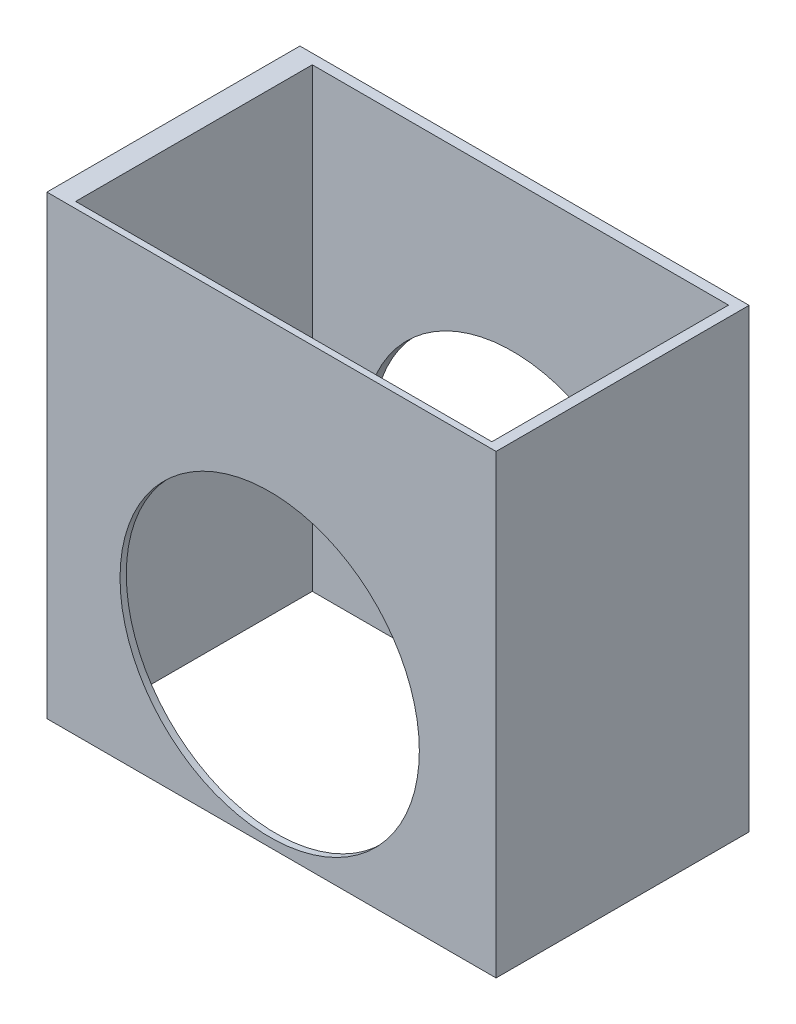
ISO-10303-21;
HEADER;
FILE_DESCRIPTION(('STEP AP214'),'2;1');
FILE_NAME('part.step','',(''),(''),'','','');
FILE_SCHEMA(('AUTOMOTIVE_DESIGN { 1 0 10303 214 1 1 1 1 }'));
ENDSEC;
DATA;
#1=APPLICATION_CONTEXT('core data for automotive mechanical design processes');
#2=APPLICATION_PROTOCOL_DEFINITION('international standard','automotive_design',2000,#1);
#3=PRODUCT_CONTEXT('',#1,'mechanical');
#4=PRODUCT('Part','Part','',(#3));
#5=PRODUCT_RELATED_PRODUCT_CATEGORY('part','',(#4));
#6=PRODUCT_DEFINITION_FORMATION('','',#4);
#7=PRODUCT_DEFINITION_CONTEXT('part definition',#1,'design');
#8=PRODUCT_DEFINITION('design','',#6,#7);
#9=PRODUCT_DEFINITION_SHAPE('','',#8);
#10=(LENGTH_UNIT() NAMED_UNIT(*) SI_UNIT(.MILLI.,.METRE.));
#11=(NAMED_UNIT(*) PLANE_ANGLE_UNIT() SI_UNIT($,.RADIAN.));
#12=(NAMED_UNIT(*) SI_UNIT($,.STERADIAN.) SOLID_ANGLE_UNIT());
#13=UNCERTAINTY_MEASURE_WITH_UNIT(LENGTH_MEASURE(1.E-05),#10,'distance_accuracy_value','');
#14=(GEOMETRIC_REPRESENTATION_CONTEXT(3) GLOBAL_UNCERTAINTY_ASSIGNED_CONTEXT((#13)) GLOBAL_UNIT_ASSIGNED_CONTEXT((#10,
#11,#12)) REPRESENTATION_CONTEXT('',''));
#15=CARTESIAN_POINT('',(0.,0.,0.));
#16=DIRECTION('',(0.,0.,1.));
#17=DIRECTION('',(1.,0.,0.));
#18=AXIS2_PLACEMENT_3D('',#15,#16,#17);
#19=CARTESIAN_POINT('',(-12.0460468644725,8.43050583882376,-22.098));
#20=DIRECTION('',(0.,0.,1.));
#21=DIRECTION('',(1.,0.,0.));
#22=AXIS2_PLACEMENT_3D('',#19,#20,#21);
#23=CYLINDRICAL_SURFACE('',#22,7.96243527646691);
#24=CARTESIAN_POINT('',(-12.0460468644725,8.43050583882376,0.536104612442211));
#25=DIRECTION('',(0.,0.,-1.));
#26=DIRECTION('',(-1.,0.,0.));
#27=AXIS2_PLACEMENT_3D('',#24,#25,#26);
#28=CIRCLE('',#27,7.96243527646691);
#29=CARTESIAN_POINT('',(-4.08361158800558,8.43050583882376,0.536104612442214));
#30=VERTEX_POINT('',#29);
#31=EDGE_CURVE('E142',#30,#30,#28,.F.);
#32=CARTESIAN_POINT('',(-12.0460468644725,8.43050583882376,0.));
#33=DIRECTION('',(0.,0.,1.));
#34=DIRECTION('',(1.,0.,0.));
#35=AXIS2_PLACEMENT_3D('',#32,#33,#34);
#36=CIRCLE('',#35,7.96243527646691);
#37=CARTESIAN_POINT('',(-4.08361158800558,8.43050583882376,0.));
#38=VERTEX_POINT('',#37);
#39=EDGE_CURVE('E151',#38,#38,#36,.T.);
#40=CARTESIAN_POINT('',(-4.08361158800558,8.43050583882376,0.536104612442214));
#41=CARTESIAN_POINT('',(-4.08361158800558,8.43050583882376,0.530520189395941));
#42=CARTESIAN_POINT('',(-4.08361158800558,8.43050583882376,0.524935766349667));
#43=CARTESIAN_POINT('',(-4.08361158800558,8.43050583882376,0.513766920257121));
#44=CARTESIAN_POINT('',(-4.08361158800558,8.43050583882376,0.508182497210847));
#45=CARTESIAN_POINT('',(-4.08361158800558,8.43050583882376,0.497013651118301));
#46=CARTESIAN_POINT('',(-4.08361158800558,8.43050583882376,0.491429228072029));
#47=CARTESIAN_POINT('',(-4.08361158800558,8.43050583882376,0.480260381979484));
#48=CARTESIAN_POINT('',(-4.08361158800558,8.43050583882376,0.47467595893321));
#49=CARTESIAN_POINT('',(-4.08361158800558,8.43050583882376,0.463507112840663));
#50=CARTESIAN_POINT('',(-4.08361158800558,8.43050583882376,0.45792268979439));
#51=CARTESIAN_POINT('',(-4.08361158800558,8.43050583882376,0.446753843701844));
#52=CARTESIAN_POINT('',(-4.08361158800558,8.43050583882376,0.441169420655572));
#53=CARTESIAN_POINT('',(-4.08361158800558,8.43050583882376,0.430000574563027));
#54=CARTESIAN_POINT('',(-4.08361158800558,8.43050583882376,0.424416151516753));
#55=CARTESIAN_POINT('',(-4.08361158800558,8.43050583882376,0.413247305424206));
#56=CARTESIAN_POINT('',(-4.08361158800558,8.43050583882376,0.407662882377933));
#57=CARTESIAN_POINT('',(-4.08361158800558,8.43050583882376,0.396494036285386));
#58=CARTESIAN_POINT('',(-4.08361158800558,8.43050583882376,0.390909613239113));
#59=CARTESIAN_POINT('',(-4.08361158800558,8.43050583882376,0.379740767146566));
#60=CARTESIAN_POINT('',(-4.08361158800558,8.43050583882376,0.374156344100293));
#61=CARTESIAN_POINT('',(-4.08361158800558,8.43050583882376,0.362987498007747));
#62=CARTESIAN_POINT('',(-4.08361158800558,8.43050583882376,0.357403074961475));
#63=CARTESIAN_POINT('',(-4.08361158800558,8.43050583882376,0.346234228868929));
#64=CARTESIAN_POINT('',(-4.08361158800558,8.43050583882376,0.340649805822656));
#65=CARTESIAN_POINT('',(-4.08361158800558,8.43050583882376,0.329480959730109));
#66=CARTESIAN_POINT('',(-4.08361158800558,8.43050583882376,0.323896536683836));
#67=CARTESIAN_POINT('',(-4.08361158800558,8.43050583882376,0.31272769059129));
#68=CARTESIAN_POINT('',(-4.08361158800558,8.43050583882376,0.307143267545018));
#69=CARTESIAN_POINT('',(-4.08361158800558,8.43050583882376,0.295974421452472));
#70=CARTESIAN_POINT('',(-4.08361158800558,8.43050583882376,0.290389998406199));
#71=CARTESIAN_POINT('',(-4.08361158800558,8.43050583882376,0.279221152313652));
#72=CARTESIAN_POINT('',(-4.08361158800558,8.43050583882376,0.273636729267379));
#73=CARTESIAN_POINT('',(-4.08361158800558,8.43050583882376,0.262467883174832));
#74=CARTESIAN_POINT('',(-4.08361158800558,8.43050583882376,0.256883460128559));
#75=CARTESIAN_POINT('',(-4.08361158800558,8.43050583882376,0.245714614036012));
#76=CARTESIAN_POINT('',(-4.08361158800558,8.43050583882376,0.240130190989738));
#77=CARTESIAN_POINT('',(-4.08361158800558,8.43050583882376,0.228961344897193));
#78=CARTESIAN_POINT('',(-4.08361158800558,8.43050583882376,0.223376921850921));
#79=CARTESIAN_POINT('',(-4.08361158800558,8.43050583882376,0.212208075758375));
#80=CARTESIAN_POINT('',(-4.08361158800558,8.43050583882376,0.206623652712101));
#81=CARTESIAN_POINT('',(-4.08361158800558,8.43050583882376,0.195454806619555));
#82=CARTESIAN_POINT('',(-4.08361158800558,8.43050583882376,0.189870383573281));
#83=CARTESIAN_POINT('',(-4.08361158800558,8.43050583882376,0.178701537480736));
#84=CARTESIAN_POINT('',(-4.08361158800558,8.43050583882376,0.173117114434463));
#85=CARTESIAN_POINT('',(-4.08361158800558,8.43050583882376,0.161948268341918));
#86=CARTESIAN_POINT('',(-4.08361158800558,8.43050583882376,0.156363845295644));
#87=CARTESIAN_POINT('',(-4.08361158800558,8.43050583882376,0.145194999203098));
#88=CARTESIAN_POINT('',(-4.08361158800558,8.43050583882376,0.139610576156824));
#89=CARTESIAN_POINT('',(-4.08361158800558,8.43050583882376,0.128441730064278));
#90=CARTESIAN_POINT('',(-4.08361158800558,8.43050583882376,0.122857307018004));
#91=CARTESIAN_POINT('',(-4.08361158800558,8.43050583882376,0.111688460925457));
#92=CARTESIAN_POINT('',(-4.08361158800558,8.43050583882376,0.106104037879184));
#93=CARTESIAN_POINT('',(-4.08361158800558,8.43050583882376,0.0949351917866384));
#94=CARTESIAN_POINT('',(-4.08361158800558,8.43050583882376,0.0893507687403661));
#95=CARTESIAN_POINT('',(-4.08361158800558,8.43050583882376,0.0781819226478205));
#96=CARTESIAN_POINT('',(-4.08361158800558,8.43050583882376,0.0725974996015471));
#97=CARTESIAN_POINT('',(-4.08361158800558,8.43050583882376,0.0614286535090003));
#98=CARTESIAN_POINT('',(-4.08361158800558,8.43050583882376,0.0558442304627269));
#99=CARTESIAN_POINT('',(-4.08361158800558,8.43050583882376,0.0446753843701813));
#100=CARTESIAN_POINT('',(-4.08361158800558,8.43050583882376,0.0390909613239091));
#101=CARTESIAN_POINT('',(-4.08361158800558,8.43050583882376,0.0279221152313635));
#102=CARTESIAN_POINT('',(-4.08361158800558,8.43050583882376,0.0223376921850901));
#103=CARTESIAN_POINT('',(-4.08361158800558,8.43050583882376,0.0111688460925433));
#104=CARTESIAN_POINT('',(-4.08361158800558,8.43050583882376,0.00558442304626992));
#105=CARTESIAN_POINT('',(-4.08361158800558,8.43050583882376,0.));
#106=B_SPLINE_CURVE_WITH_KNOTS('',3,(#40,#41,#42,#43,#44,#45,#46,#47,#48,#49,#50,#51,#52,#53,
#54,#55,#56,#57,#58,#59,#60,#61,#62,#63,#64,#65,#66,#67,#68,#69,#70,#71,#72,#73,#74,#75,#76,#77,
#78,#79,#80,#81,#82,#83,#84,#85,#86,#87,#88,#89,#90,#91,#92,#93,#94,#95,#96,#97,#98,#99,#100,
#101,#102,#103,#104,#105),.UNSPECIFIED.,.F.,.F.,(4,2,2,2,2,2,2,2,2,2,2,2,2,2,2,2,2,2,2,2,2,2,2,
2,2,2,2,2,2,2,2,2,4),(0.,0.0167532691388202,0.0335065382776403,0.050259807416457,
0.0670130765552772,0.0837663456940974,0.100519614832914,0.117272883971734,0.134026153110554,
0.150779422249375,0.167532691388195,0.184285960527011,0.201039229665832,0.217792498804652,
0.234545767943468,0.251299037082289,0.268052306221109,0.284805575359929,0.301558844498749,
0.318312113637566,0.335065382776386,0.351818651915206,0.368571921054023,0.385325190192843,
0.402078459331663,0.418831728470483,0.435584997609303,0.45233826674812,0.46909153588694,
0.48584480502576,0.502598074164577,0.519351343303397,0.536104612442218),.UNSPECIFIED.);
#107=EDGE_CURVE('BSEAM38',#30,#38,#106,.T.);
#108=ORIENTED_EDGE('',*,*,#31,.T.);
#109=ORIENTED_EDGE('',*,*,#39,.F.);
#110=ORIENTED_EDGE('',*,*,#107,.T.);
#111=ORIENTED_EDGE('',*,*,#107,.F.);
#112=EDGE_LOOP('',(#108,#110,#109,#111));
#113=FACE_BOUND('',#112,.T.);
#114=ADVANCED_FACE('F38',(#113),#23,.F.);
#115=CARTESIAN_POINT('',(0.,0.,13.462));
#116=DIRECTION('',(-1.,0.,0.));
#117=DIRECTION('',(0.,0.,1.));
#118=AXIS2_PLACEMENT_3D('',#115,#116,#117);
#119=PLANE('',#118);
#120=DIRECTION('',(0.,1.,0.));
#121=VECTOR('',#120,1.);
#122=CARTESIAN_POINT('',(0.,0.,0.));
#123=LINE('',#122,#121);
#124=CARTESIAN_POINT('',(0.,0.,0.));
#125=VERTEX_POINT('',#124);
#126=CARTESIAN_POINT('',(0.,24.2638461745729,0.));
#127=VERTEX_POINT('',#126);
#128=EDGE_CURVE('E167',#125,#127,#123,.T.);
#129=ORIENTED_EDGE('',*,*,#128,.T.);
#130=DIRECTION('',(0.,0.,-1.));
#131=VECTOR('',#130,1.);
#132=CARTESIAN_POINT('',(0.,24.2638461745729,13.462));
#133=LINE('',#132,#131);
#134=CARTESIAN_POINT('',(0.,24.2638461745729,13.462));
#135=VERTEX_POINT('',#134);
#136=EDGE_CURVE('E190',#135,#127,#133,.T.);
#137=ORIENTED_EDGE('',*,*,#136,.F.);
#138=DIRECTION('',(0.,1.,0.));
#139=VECTOR('',#138,1.);
#140=CARTESIAN_POINT('',(0.,0.,13.462));
#141=LINE('',#140,#139);
#142=CARTESIAN_POINT('',(0.,0.,13.462));
#143=VERTEX_POINT('',#142);
#144=EDGE_CURVE('E152',#143,#135,#141,.T.);
#145=ORIENTED_EDGE('',*,*,#144,.F.);
#146=DIRECTION('',(0.,0.,-1.));
#147=VECTOR('',#146,1.);
#148=CARTESIAN_POINT('',(0.,0.,13.462));
#149=LINE('',#148,#147);
#150=EDGE_CURVE('E166',#143,#125,#149,.T.);
#151=ORIENTED_EDGE('',*,*,#150,.T.);
#152=EDGE_LOOP('',(#129,#137,#145,#151));
#153=FACE_BOUND('',#152,.T.);
#154=ADVANCED_FACE('F40',(#153),#119,.F.);
#155=CARTESIAN_POINT('',(0.,24.2638461745729,13.462));
#156=DIRECTION('',(0.,-1.,0.));
#157=DIRECTION('',(0.,0.,-1.));
#158=AXIS2_PLACEMENT_3D('',#155,#156,#157);
#159=PLANE('',#158);
#160=DIRECTION('',(1.,0.,0.));
#161=VECTOR('',#160,1.);
#162=CARTESIAN_POINT('',(-22.7037503225376,24.2638461745729,13.1276553067743));
#163=LINE('',#162,#161);
#164=CARTESIAN_POINT('',(-22.7037503225376,24.2638461745729,13.1276553067743));
#165=VERTEX_POINT('',#164);
#166=CARTESIAN_POINT('',(-0.558299295930112,24.2638461745729,13.1276553067743));
#167=VERTEX_POINT('',#166);
#168=EDGE_CURVE('E116',#165,#167,#163,.T.);
#169=ORIENTED_EDGE('',*,*,#168,.F.);
#170=DIRECTION('',(0.,0.,1.));
#171=VECTOR('',#170,1.);
#172=CARTESIAN_POINT('',(-22.7037503225376,24.2638461745729,0.536104612442211));
#173=LINE('',#172,#171);
#174=CARTESIAN_POINT('',(-22.7037503225376,24.2638461745729,0.536104612442211));
#175=VERTEX_POINT('',#174);
#176=EDGE_CURVE('E54',#175,#165,#173,.T.);
#177=ORIENTED_EDGE('',*,*,#176,.F.);
#178=DIRECTION('',(-1.,0.,0.));
#179=VECTOR('',#178,1.);
#180=CARTESIAN_POINT('',(-22.7037503225376,24.2638461745729,0.536104612442211));
#181=LINE('',#180,#179);
#182=CARTESIAN_POINT('',(-0.558299295930112,24.2638461745729,0.536104612442211));
#183=VERTEX_POINT('',#182);
#184=EDGE_CURVE('E124',#183,#175,#181,.T.);
#185=ORIENTED_EDGE('',*,*,#184,.F.);
#186=DIRECTION('',(0.,0.,-1.));
#187=VECTOR('',#186,1.);
#188=CARTESIAN_POINT('',(-0.558299295930112,24.2638461745729,0.536104612442211));
#189=LINE('',#188,#187);
#190=EDGE_CURVE('E107',#167,#183,#189,.T.);
#191=ORIENTED_EDGE('',*,*,#190,.F.);
#192=EDGE_LOOP('',(#169,#177,#185,#191));
#193=FACE_BOUND('',#192,.T.);
#194=DIRECTION('',(-1.,0.,0.));
#195=VECTOR('',#194,1.);
#196=CARTESIAN_POINT('',(0.,24.2638461745729,0.));
#197=LINE('',#196,#195);
#198=CARTESIAN_POINT('',(-23.8989763072861,24.2638461745729,0.));
#199=VERTEX_POINT('',#198);
#200=EDGE_CURVE('E171',#127,#199,#197,.T.);
#201=ORIENTED_EDGE('',*,*,#200,.T.);
#202=DIRECTION('',(0.,0.,-1.));
#203=VECTOR('',#202,1.);
#204=CARTESIAN_POINT('',(-23.8989763072861,24.2638461745729,13.462));
#205=LINE('',#204,#203);
#206=CARTESIAN_POINT('',(-23.8989763072861,24.2638461745729,13.462));
#207=VERTEX_POINT('',#206);
#208=EDGE_CURVE('E186',#207,#199,#205,.T.);
#209=ORIENTED_EDGE('',*,*,#208,.F.);
#210=DIRECTION('',(-1.,0.,0.));
#211=VECTOR('',#210,1.);
#212=CARTESIAN_POINT('',(0.,24.2638461745729,13.462));
#213=LINE('',#212,#211);
#214=EDGE_CURVE('E156',#135,#207,#213,.T.);
#215=ORIENTED_EDGE('',*,*,#214,.F.);
#216=ORIENTED_EDGE('',*,*,#136,.T.);
#217=EDGE_LOOP('',(#201,#209,#215,#216));
#218=FACE_BOUND('',#217,.T.);
#219=ADVANCED_FACE('F121',(#193,#218),#159,.F.);
#220=CARTESIAN_POINT('',(-23.8989763072861,0.,13.462));
#221=DIRECTION('',(1.,0.,0.));
#222=DIRECTION('',(0.,0.,-1.));
#223=AXIS2_PLACEMENT_3D('',#220,#221,#222);
#224=PLANE('',#223);
#225=DIRECTION('',(0.,-1.,0.));
#226=VECTOR('',#225,1.);
#227=CARTESIAN_POINT('',(-23.8989763072861,0.,0.));
#228=LINE('',#227,#226);
#229=CARTESIAN_POINT('',(-23.8989763072861,0.,0.));
#230=VERTEX_POINT('',#229);
#231=EDGE_CURVE('E174',#199,#230,#228,.T.);
#232=ORIENTED_EDGE('',*,*,#231,.T.);
#233=DIRECTION('',(0.,0.,-1.));
#234=VECTOR('',#233,1.);
#235=CARTESIAN_POINT('',(-23.8989763072861,0.,13.462));
#236=LINE('',#235,#234);
#237=CARTESIAN_POINT('',(-23.8989763072861,0.,13.462));
#238=VERTEX_POINT('',#237);
#239=EDGE_CURVE('E182',#238,#230,#236,.T.);
#240=ORIENTED_EDGE('',*,*,#239,.F.);
#241=DIRECTION('',(0.,-1.,0.));
#242=VECTOR('',#241,1.);
#243=CARTESIAN_POINT('',(-23.8989763072861,0.,13.462));
#244=LINE('',#243,#242);
#245=EDGE_CURVE('E160',#207,#238,#244,.T.);
#246=ORIENTED_EDGE('',*,*,#245,.F.);
#247=ORIENTED_EDGE('',*,*,#208,.T.);
#248=EDGE_LOOP('',(#232,#240,#246,#247));
#249=FACE_BOUND('',#248,.T.);
#250=ADVANCED_FACE('F260',(#249),#224,.F.);
#251=CARTESIAN_POINT('',(0.,0.,13.462));
#252=DIRECTION('',(0.,1.,0.));
#253=DIRECTION('',(0.,0.,1.));
#254=AXIS2_PLACEMENT_3D('',#251,#252,#253);
#255=PLANE('',#254);
#256=DIRECTION('',(-1.,0.,0.));
#257=VECTOR('',#256,1.);
#258=CARTESIAN_POINT('',(0.,0.,0.536104612442211));
#259=LINE('',#258,#257);
#260=CARTESIAN_POINT('',(-0.558299295930112,0.,0.536104612442211));
#261=VERTEX_POINT('',#260);
#262=CARTESIAN_POINT('',(-22.7037503225376,0.,0.536104612442211));
#263=VERTEX_POINT('',#262);
#264=EDGE_CURVE('E143',#261,#263,#259,.T.);
#265=ORIENTED_EDGE('',*,*,#264,.T.);
#266=DIRECTION('',(0.,0.,1.));
#267=VECTOR('',#266,1.);
#268=CARTESIAN_POINT('',(-22.7037503225376,0.,13.462));
#269=LINE('',#268,#267);
#270=CARTESIAN_POINT('',(-22.7037503225376,0.,13.1276553067743));
#271=VERTEX_POINT('',#270);
#272=EDGE_CURVE('E11',#263,#271,#269,.T.);
#273=ORIENTED_EDGE('',*,*,#272,.T.);
#274=DIRECTION('',(1.,0.,0.));
#275=VECTOR('',#274,1.);
#276=CARTESIAN_POINT('',(0.,0.,13.1276553067743));
#277=LINE('',#276,#275);
#278=CARTESIAN_POINT('',(-0.558299295930112,0.,13.1276553067743));
#279=VERTEX_POINT('',#278);
#280=EDGE_CURVE('E139',#271,#279,#277,.T.);
#281=ORIENTED_EDGE('',*,*,#280,.T.);
#282=DIRECTION('',(0.,0.,-1.));
#283=VECTOR('',#282,1.);
#284=CARTESIAN_POINT('',(-0.558299295930112,0.,13.462));
#285=LINE('',#284,#283);
#286=EDGE_CURVE('E47',#279,#261,#285,.T.);
#287=ORIENTED_EDGE('',*,*,#286,.T.);
#288=EDGE_LOOP('',(#265,#273,#281,#287));
#289=FACE_BOUND('',#288,.T.);
#290=DIRECTION('',(1.,0.,0.));
#291=VECTOR('',#290,1.);
#292=CARTESIAN_POINT('',(0.,0.,0.));
#293=LINE('',#292,#291);
#294=EDGE_CURVE('E157',#230,#125,#293,.T.);
#295=ORIENTED_EDGE('',*,*,#294,.T.);
#296=ORIENTED_EDGE('',*,*,#150,.F.);
#297=DIRECTION('',(1.,0.,0.));
#298=VECTOR('',#297,1.);
#299=CARTESIAN_POINT('',(0.,0.,13.462));
#300=LINE('',#299,#298);
#301=EDGE_CURVE('E163',#238,#143,#300,.T.);
#302=ORIENTED_EDGE('',*,*,#301,.F.);
#303=ORIENTED_EDGE('',*,*,#239,.T.);
#304=EDGE_LOOP('',(#295,#296,#302,#303));
#305=FACE_BOUND('',#304,.T.);
#306=ADVANCED_FACE('F204',(#289,#305),#255,.F.);
#307=CARTESIAN_POINT('',(0.,0.,13.462));
#308=DIRECTION('',(0.,0.,1.));
#309=DIRECTION('',(1.,0.,0.));
#310=AXIS2_PLACEMENT_3D('',#307,#308,#309);
#311=PLANE('',#310);
#312=CARTESIAN_POINT('',(-12.0460468644725,8.43050583882376,13.462));
#313=DIRECTION('',(0.,0.,1.));
#314=DIRECTION('',(1.,0.,0.));
#315=AXIS2_PLACEMENT_3D('',#312,#313,#314);
#316=CIRCLE('',#315,7.96243527646691);
#317=CARTESIAN_POINT('',(-4.08361158800558,8.43050583882376,13.462));
#318=VERTEX_POINT('',#317);
#319=EDGE_CURVE('E147',#318,#318,#316,.T.);
#320=ORIENTED_EDGE('',*,*,#319,.F.);
#321=EDGE_LOOP('',(#320));
#322=FACE_BOUND('',#321,.T.);
#323=ORIENTED_EDGE('',*,*,#144,.T.);
#324=ORIENTED_EDGE('',*,*,#214,.T.);
#325=ORIENTED_EDGE('',*,*,#245,.T.);
#326=ORIENTED_EDGE('',*,*,#301,.T.);
#327=EDGE_LOOP('',(#323,#324,#325,#326));
#328=FACE_BOUND('',#327,.T.);
#329=ADVANCED_FACE('F241',(#322,#328),#311,.T.);
#330=CARTESIAN_POINT('',(0.,0.,0.));
#331=DIRECTION('',(0.,0.,1.));
#332=DIRECTION('',(1.,0.,0.));
#333=AXIS2_PLACEMENT_3D('',#330,#331,#332);
#334=PLANE('',#333);
#335=ORIENTED_EDGE('',*,*,#39,.T.);
#336=EDGE_LOOP('',(#335));
#337=FACE_BOUND('',#336,.T.);
#338=ORIENTED_EDGE('',*,*,#128,.F.);
#339=ORIENTED_EDGE('',*,*,#294,.F.);
#340=ORIENTED_EDGE('',*,*,#231,.F.);
#341=ORIENTED_EDGE('',*,*,#200,.F.);
#342=EDGE_LOOP('',(#338,#339,#340,#341));
#343=FACE_BOUND('',#342,.T.);
#344=ADVANCED_FACE('F235',(#337,#343),#334,.F.);
#345=CARTESIAN_POINT('',(-12.0460468644725,8.43050583882376,13.1276553067744));
#346=DIRECTION('',(0.,0.,1.));
#347=DIRECTION('',(1.,0.,0.));
#348=AXIS2_PLACEMENT_3D('',#345,#346,#347);
#349=CIRCLE('',#348,7.96243527646691);
#350=CARTESIAN_POINT('',(-4.08361158800558,8.43050583882376,13.1276553067743));
#351=VERTEX_POINT('',#350);
#352=EDGE_CURVE('E134',#351,#351,#349,.F.);
#353=CARTESIAN_POINT('',(-4.08361158800558,8.43050583882376,13.1276553067743));
#354=CARTESIAN_POINT('',(-4.08361158800558,8.43050583882376,13.1311380639954));
#355=CARTESIAN_POINT('',(-4.08361158800558,8.43050583882376,13.1346208212165));
#356=CARTESIAN_POINT('',(-4.08361158800558,8.43050583882376,13.1415863356587));
#357=CARTESIAN_POINT('',(-4.08361158800558,8.43050583882376,13.1450690928798));
#358=CARTESIAN_POINT('',(-4.08361158800558,8.43050583882376,13.152034607322));
#359=CARTESIAN_POINT('',(-4.08361158800558,8.43050583882376,13.1555173645431));
#360=CARTESIAN_POINT('',(-4.08361158800558,8.43050583882376,13.1624828789854));
#361=CARTESIAN_POINT('',(-4.08361158800558,8.43050583882376,13.1659656362065));
#362=CARTESIAN_POINT('',(-4.08361158800558,8.43050583882376,13.1729311506487));
#363=CARTESIAN_POINT('',(-4.08361158800558,8.43050583882376,13.1764139078698));
#364=CARTESIAN_POINT('',(-4.08361158800558,8.43050583882376,13.183379422312));
#365=CARTESIAN_POINT('',(-4.08361158800558,8.43050583882376,13.1868621795331));
#366=CARTESIAN_POINT('',(-4.08361158800558,8.43050583882376,13.1938276939753));
#367=CARTESIAN_POINT('',(-4.08361158800558,8.43050583882376,13.1973104511964));
#368=CARTESIAN_POINT('',(-4.08361158800558,8.43050583882376,13.2042759656386));
#369=CARTESIAN_POINT('',(-4.08361158800558,8.43050583882376,13.2077587228597));
#370=CARTESIAN_POINT('',(-4.08361158800558,8.43050583882376,13.2147242373019));
#371=CARTESIAN_POINT('',(-4.08361158800558,8.43050583882376,13.218206994523));
#372=CARTESIAN_POINT('',(-4.08361158800558,8.43050583882376,13.2251725089652));
#373=CARTESIAN_POINT('',(-4.08361158800558,8.43050583882376,13.2286552661863));
#374=CARTESIAN_POINT('',(-4.08361158800558,8.43050583882376,13.2356207806285));
#375=CARTESIAN_POINT('',(-4.08361158800558,8.43050583882376,13.2391035378496));
#376=CARTESIAN_POINT('',(-4.08361158800558,8.43050583882376,13.2460690522918));
#377=CARTESIAN_POINT('',(-4.08361158800558,8.43050583882376,13.2495518095129));
#378=CARTESIAN_POINT('',(-4.08361158800558,8.43050583882376,13.2565173239551));
#379=CARTESIAN_POINT('',(-4.08361158800558,8.43050583882376,13.2600000811762));
#380=CARTESIAN_POINT('',(-4.08361158800558,8.43050583882376,13.2669655956184));
#381=CARTESIAN_POINT('',(-4.08361158800558,8.43050583882376,13.2704483528395));
#382=CARTESIAN_POINT('',(-4.08361158800558,8.43050583882376,13.2774138672817));
#383=CARTESIAN_POINT('',(-4.08361158800558,8.43050583882376,13.2808966245028));
#384=CARTESIAN_POINT('',(-4.08361158800558,8.43050583882376,13.287862138945));
#385=CARTESIAN_POINT('',(-4.08361158800558,8.43050583882376,13.2913448961661));
#386=CARTESIAN_POINT('',(-4.08361158800558,8.43050583882376,13.2983104106083));
#387=CARTESIAN_POINT('',(-4.08361158800558,8.43050583882376,13.3017931678294));
#388=CARTESIAN_POINT('',(-4.08361158800558,8.43050583882376,13.3087586822716));
#389=CARTESIAN_POINT('',(-4.08361158800558,8.43050583882376,13.3122414394927));
#390=CARTESIAN_POINT('',(-4.08361158800558,8.43050583882376,13.3192069539349));
#391=CARTESIAN_POINT('',(-4.08361158800558,8.43050583882376,13.322689711156));
#392=CARTESIAN_POINT('',(-4.08361158800558,8.43050583882376,13.3296552255982));
#393=CARTESIAN_POINT('',(-4.08361158800558,8.43050583882376,13.3331379828193));
#394=CARTESIAN_POINT('',(-4.08361158800558,8.43050583882376,13.3401034972615));
#395=CARTESIAN_POINT('',(-4.08361158800558,8.43050583882376,13.3435862544826));
#396=CARTESIAN_POINT('',(-4.08361158800558,8.43050583882376,13.3505517689248));
#397=CARTESIAN_POINT('',(-4.08361158800558,8.43050583882376,13.3540345261459));
#398=CARTESIAN_POINT('',(-4.08361158800558,8.43050583882376,13.3610000405881));
#399=CARTESIAN_POINT('',(-4.08361158800558,8.43050583882376,13.3644827978092));
#400=CARTESIAN_POINT('',(-4.08361158800558,8.43050583882376,13.3714483122514));
#401=CARTESIAN_POINT('',(-4.08361158800558,8.43050583882376,13.3749310694725));
#402=CARTESIAN_POINT('',(-4.08361158800558,8.43050583882376,13.3818965839147));
#403=CARTESIAN_POINT('',(-4.08361158800558,8.43050583882376,13.3853793411358));
#404=CARTESIAN_POINT('',(-4.08361158800558,8.43050583882376,13.392344855578));
#405=CARTESIAN_POINT('',(-4.08361158800558,8.43050583882376,13.3958276127991));
#406=CARTESIAN_POINT('',(-4.08361158800558,8.43050583882376,13.4027931272413));
#407=CARTESIAN_POINT('',(-4.08361158800558,8.43050583882376,13.4062758844624));
#408=CARTESIAN_POINT('',(-4.08361158800558,8.43050583882376,13.4132413989046));
#409=CARTESIAN_POINT('',(-4.08361158800558,8.43050583882376,13.4167241561257));
#410=CARTESIAN_POINT('',(-4.08361158800558,8.43050583882376,13.4236896705679));
#411=CARTESIAN_POINT('',(-4.08361158800558,8.43050583882376,13.427172427789));
#412=CARTESIAN_POINT('',(-4.08361158800558,8.43050583882376,13.4341379422312));
#413=CARTESIAN_POINT('',(-4.08361158800558,8.43050583882376,13.4376206994523));
#414=CARTESIAN_POINT('',(-4.08361158800558,8.43050583882376,13.4445862138945));
#415=CARTESIAN_POINT('',(-4.08361158800558,8.43050583882376,13.4480689711156));
#416=CARTESIAN_POINT('',(-4.08361158800558,8.43050583882376,13.4550344855578));
#417=CARTESIAN_POINT('',(-4.08361158800558,8.43050583882376,13.4585172427789));
#418=CARTESIAN_POINT('',(-4.08361158800558,8.43050583882376,13.462));
#419=B_SPLINE_CURVE_WITH_KNOTS('',3,(#353,#354,#355,#356,#357,#358,#359,#360,#361,#362,#363,
#364,#365,#366,#367,#368,#369,#370,#371,#372,#373,#374,#375,#376,#377,#378,#379,#380,#381,#382,
#383,#384,#385,#386,#387,#388,#389,#390,#391,#392,#393,#394,#395,#396,#397,#398,#399,#400,#401,
#402,#403,#404,#405,#406,#407,#408,#409,#410,#411,#412,#413,#414,#415,#416,#417,#418),
.UNSPECIFIED.,.F.,.F.,(4,2,2,2,2,2,2,2,2,2,2,2,2,2,2,2,2,2,2,2,2,2,2,2,2,2,2,2,2,2,2,2,4),(0.,
0.0104482716632992,0.0208965433266053,0.0313448149899045,0.0417930866532107,0.0522413583165099,
0.0626896299798091,0.0731379016431152,0.0835861733064144,0.0940344449697136,0.10448271663302,
0.114930988296319,0.125379259959618,0.135827531622924,0.146275803286224,0.15672407494953,
0.167172346612829,0.177620618276128,0.188068889939434,0.198517161602733,0.20896543326604,
0.219413704929339,0.229861976592638,0.240310248255944,0.250758519919243,0.261206791582543,
0.271655063245849,0.282103334909148,0.292551606572447,0.302999878235753,0.313448149899052,
0.323896421562359,0.334344693225658),.UNSPECIFIED.);
#420=EDGE_CURVE('BSEAM225',#351,#318,#419,.T.);
#421=ORIENTED_EDGE('',*,*,#352,.T.);
#422=ORIENTED_EDGE('',*,*,#319,.T.);
#423=ORIENTED_EDGE('',*,*,#420,.T.);
#424=ORIENTED_EDGE('',*,*,#420,.F.);
#425=EDGE_LOOP('',(#421,#423,#422,#424));
#426=FACE_BOUND('',#425,.T.);
#427=ADVANCED_FACE('F225',(#426),#23,.F.);
#428=CARTESIAN_POINT('',(-22.7037503225376,-143.376153825427,0.536104612442211));
#429=DIRECTION('',(-1.,0.,0.));
#430=DIRECTION('',(0.,0.,1.));
#431=AXIS2_PLACEMENT_3D('',#428,#429,#430);
#432=PLANE('',#431);
#433=DIRECTION('',(0.,1.,0.));
#434=VECTOR('',#433,1.);
#435=CARTESIAN_POINT('',(-22.7037503225376,-143.376153825427,0.536104612442211));
#436=LINE('',#435,#434);
#437=EDGE_CURVE('E131',#263,#175,#436,.T.);
#438=ORIENTED_EDGE('',*,*,#437,.T.);
#439=ORIENTED_EDGE('',*,*,#176,.T.);
#440=DIRECTION('',(0.,1.,0.));
#441=VECTOR('',#440,1.);
#442=CARTESIAN_POINT('',(-22.7037503225376,-143.376153825427,13.1276553067743));
#443=LINE('',#442,#441);
#444=EDGE_CURVE('E113',#271,#165,#443,.T.);
#445=ORIENTED_EDGE('',*,*,#444,.F.);
#446=ORIENTED_EDGE('',*,*,#272,.F.);
#447=EDGE_LOOP('',(#438,#439,#445,#446));
#448=FACE_BOUND('',#447,.T.);
#449=ADVANCED_FACE('F206',(#448),#432,.F.);
#450=CARTESIAN_POINT('',(-0.558299295930112,-143.376153825427,0.536104612442211));
#451=DIRECTION('',(1.,0.,0.));
#452=DIRECTION('',(0.,0.,-1.));
#453=AXIS2_PLACEMENT_3D('',#450,#451,#452);
#454=PLANE('',#453);
#455=DIRECTION('',(0.,1.,0.));
#456=VECTOR('',#455,1.);
#457=CARTESIAN_POINT('',(-0.558299295930112,-143.376153825427,13.1276553067743));
#458=LINE('',#457,#456);
#459=EDGE_CURVE('E62',#279,#167,#458,.T.);
#460=ORIENTED_EDGE('',*,*,#459,.T.);
#461=ORIENTED_EDGE('',*,*,#190,.T.);
#462=DIRECTION('',(0.,1.,0.));
#463=VECTOR('',#462,1.);
#464=CARTESIAN_POINT('',(-0.558299295930112,-143.376153825427,0.536104612442211));
#465=LINE('',#464,#463);
#466=EDGE_CURVE('E112',#261,#183,#465,.T.);
#467=ORIENTED_EDGE('',*,*,#466,.F.);
#468=ORIENTED_EDGE('',*,*,#286,.F.);
#469=EDGE_LOOP('',(#460,#461,#467,#468));
#470=FACE_BOUND('',#469,.T.);
#471=ADVANCED_FACE('F104',(#470),#454,.F.);
#472=CARTESIAN_POINT('',(-22.7037503225376,-143.376153825427,0.536104612442211));
#473=DIRECTION('',(0.,0.,-1.));
#474=DIRECTION('',(-1.,0.,0.));
#475=AXIS2_PLACEMENT_3D('',#472,#473,#474);
#476=PLANE('',#475);
#477=ORIENTED_EDGE('',*,*,#31,.F.);
#478=EDGE_LOOP('',(#477));
#479=FACE_BOUND('',#478,.T.);
#480=ORIENTED_EDGE('',*,*,#466,.T.);
#481=ORIENTED_EDGE('',*,*,#184,.T.);
#482=ORIENTED_EDGE('',*,*,#437,.F.);
#483=ORIENTED_EDGE('',*,*,#264,.F.);
#484=EDGE_LOOP('',(#480,#481,#482,#483));
#485=FACE_BOUND('',#484,.T.);
#486=ADVANCED_FACE('F209',(#479,#485),#476,.F.);
#487=CARTESIAN_POINT('',(-22.7037503225376,-143.376153825427,13.1276553067743));
#488=DIRECTION('',(0.,0.,1.));
#489=DIRECTION('',(1.,0.,0.));
#490=AXIS2_PLACEMENT_3D('',#487,#488,#489);
#491=PLANE('',#490);
#492=ORIENTED_EDGE('',*,*,#352,.F.);
#493=EDGE_LOOP('',(#492));
#494=FACE_BOUND('',#493,.T.);
#495=ORIENTED_EDGE('',*,*,#444,.T.);
#496=ORIENTED_EDGE('',*,*,#168,.T.);
#497=ORIENTED_EDGE('',*,*,#459,.F.);
#498=ORIENTED_EDGE('',*,*,#280,.F.);
#499=EDGE_LOOP('',(#495,#496,#497,#498));
#500=FACE_BOUND('',#499,.T.);
#501=ADVANCED_FACE('F117',(#494,#500),#491,.F.);
#502=CLOSED_SHELL('',(#114,#154,#219,#250,#306,#329,#344,#427,#449,#471,#486,#501));
#503=MANIFOLD_SOLID_BREP('B2',#502);
#504=ADVANCED_BREP_SHAPE_REPRESENTATION('',(#18,#503),#14);
#505=SHAPE_DEFINITION_REPRESENTATION(#9,#504);
ENDSEC;
END-ISO-10303-21;
